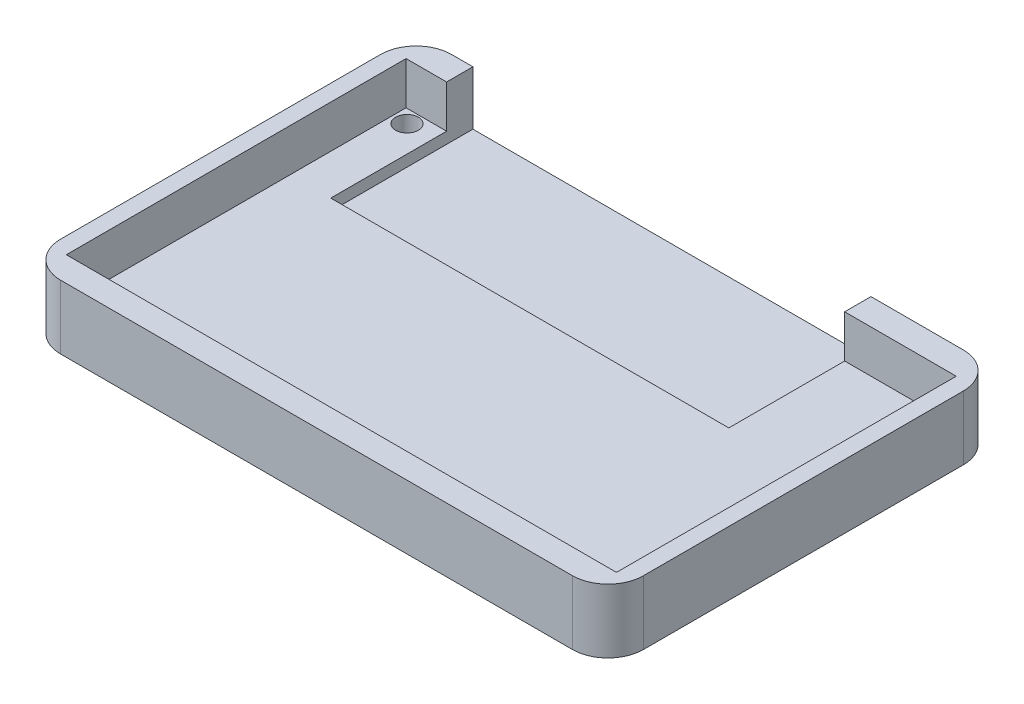
ISO-10303-21;
HEADER;
FILE_DESCRIPTION(('STEP AP214'),'2;1');
FILE_NAME('part.step','',(''),(''),'','','');
FILE_SCHEMA(('AUTOMOTIVE_DESIGN { 1 0 10303 214 1 1 1 1 }'));
ENDSEC;
DATA;
#1=APPLICATION_CONTEXT('core data for automotive mechanical design processes');
#2=APPLICATION_PROTOCOL_DEFINITION('international standard','automotive_design',2000,#1);
#3=PRODUCT_CONTEXT('',#1,'mechanical');
#4=PRODUCT('Part','Part','',(#3));
#5=PRODUCT_RELATED_PRODUCT_CATEGORY('part','',(#4));
#6=PRODUCT_DEFINITION_FORMATION('','',#4);
#7=PRODUCT_DEFINITION_CONTEXT('part definition',#1,'design');
#8=PRODUCT_DEFINITION('design','',#6,#7);
#9=PRODUCT_DEFINITION_SHAPE('','',#8);
#10=(LENGTH_UNIT() NAMED_UNIT(*) SI_UNIT(.MILLI.,.METRE.));
#11=(NAMED_UNIT(*) PLANE_ANGLE_UNIT() SI_UNIT($,.RADIAN.));
#12=(NAMED_UNIT(*) SI_UNIT($,.STERADIAN.) SOLID_ANGLE_UNIT());
#13=UNCERTAINTY_MEASURE_WITH_UNIT(LENGTH_MEASURE(1.E-05),#10,'distance_accuracy_value','');
#14=(GEOMETRIC_REPRESENTATION_CONTEXT(3) GLOBAL_UNCERTAINTY_ASSIGNED_CONTEXT((#13)) GLOBAL_UNIT_ASSIGNED_CONTEXT((#10,
#11,#12)) REPRESENTATION_CONTEXT('',''));
#15=CARTESIAN_POINT('',(0.,0.,0.));
#16=DIRECTION('',(0.,0.,1.));
#17=DIRECTION('',(1.,0.,0.));
#18=AXIS2_PLACEMENT_3D('',#15,#16,#17);
#19=CARTESIAN_POINT('',(0.,11.43,0.));
#20=DIRECTION('',(0.,1.,0.));
#21=DIRECTION('',(0.,0.,1.));
#22=AXIS2_PLACEMENT_3D('',#19,#20,#21);
#23=PLANE('',#22);
#24=DIRECTION('',(-1.,0.,0.));
#25=VECTOR('',#24,1.);
#26=CARTESIAN_POINT('',(-52.07,11.43,-34.925));
#27=LINE('',#26,#25);
#28=CARTESIAN_POINT('',(-41.91,11.43,-34.925));
#29=VERTEX_POINT('',#28);
#30=CARTESIAN_POINT('',(-45.72,11.43,-34.925));
#31=VERTEX_POINT('',#30);
#32=EDGE_CURVE('E254',#29,#31,#27,.T.);
#33=ORIENTED_EDGE('',*,*,#32,.T.);
#34=CARTESIAN_POINT('',(-45.72,11.43,-28.575));
#35=DIRECTION('',(0.,1.,0.));
#36=DIRECTION('',(0.,0.,1.));
#37=AXIS2_PLACEMENT_3D('',#34,#35,#36);
#38=CIRCLE('',#37,6.35);
#39=CARTESIAN_POINT('',(-52.07,11.43,-28.575));
#40=VERTEX_POINT('',#39);
#41=EDGE_CURVE('E310',#31,#40,#38,.T.);
#42=ORIENTED_EDGE('',*,*,#41,.T.);
#43=DIRECTION('',(0.,0.,1.));
#44=VECTOR('',#43,1.);
#45=CARTESIAN_POINT('',(-52.07,11.43,-34.925));
#46=LINE('',#45,#44);
#47=CARTESIAN_POINT('',(-52.07,11.43,28.575));
#48=VERTEX_POINT('',#47);
#49=EDGE_CURVE('E246',#40,#48,#46,.T.);
#50=ORIENTED_EDGE('',*,*,#49,.T.);
#51=CARTESIAN_POINT('',(-45.72,11.43,28.575));
#52=DIRECTION('',(0.,1.,0.));
#53=DIRECTION('',(0.,0.,1.));
#54=AXIS2_PLACEMENT_3D('',#51,#52,#53);
#55=CIRCLE('',#54,6.35);
#56=CARTESIAN_POINT('',(-45.72,11.43,34.925));
#57=VERTEX_POINT('',#56);
#58=EDGE_CURVE('E308',#48,#57,#55,.T.);
#59=ORIENTED_EDGE('',*,*,#58,.T.);
#60=DIRECTION('',(1.,0.,0.));
#61=VECTOR('',#60,1.);
#62=CARTESIAN_POINT('',(-52.07,11.43,34.925));
#63=LINE('',#62,#61);
#64=CARTESIAN_POINT('',(45.72,11.43,34.925));
#65=VERTEX_POINT('',#64);
#66=EDGE_CURVE('E249',#57,#65,#63,.T.);
#67=ORIENTED_EDGE('',*,*,#66,.T.);
#68=CARTESIAN_POINT('',(45.72,11.43,28.575));
#69=DIRECTION('',(0.,1.,0.));
#70=DIRECTION('',(0.,0.,1.));
#71=AXIS2_PLACEMENT_3D('',#68,#69,#70);
#72=CIRCLE('',#71,6.35);
#73=CARTESIAN_POINT('',(52.07,11.43,28.575));
#74=VERTEX_POINT('',#73);
#75=EDGE_CURVE('E59',#65,#74,#72,.T.);
#76=ORIENTED_EDGE('',*,*,#75,.T.);
#77=DIRECTION('',(0.,0.,-1.));
#78=VECTOR('',#77,1.);
#79=CARTESIAN_POINT('',(52.07,11.43,-34.925));
#80=LINE('',#79,#78);
#81=CARTESIAN_POINT('',(52.07,11.43,-28.575));
#82=VERTEX_POINT('',#81);
#83=EDGE_CURVE('E252',#74,#82,#80,.T.);
#84=ORIENTED_EDGE('',*,*,#83,.T.);
#85=CARTESIAN_POINT('',(45.72,11.43,-28.575));
#86=DIRECTION('',(0.,1.,0.));
#87=DIRECTION('',(0.,0.,1.));
#88=AXIS2_PLACEMENT_3D('',#85,#86,#87);
#89=CIRCLE('',#88,6.35);
#90=CARTESIAN_POINT('',(45.72,11.43,-34.925));
#91=VERTEX_POINT('',#90);
#92=EDGE_CURVE('E306',#82,#91,#89,.T.);
#93=ORIENTED_EDGE('',*,*,#92,.T.);
#94=CARTESIAN_POINT('',(29.21,11.43,-34.925));
#95=VERTEX_POINT('',#94);
#96=EDGE_CURVE('E255',#91,#95,#27,.T.);
#97=ORIENTED_EDGE('',*,*,#96,.T.);
#98=DIRECTION('',(0.,0.,-1.));
#99=VECTOR('',#98,1.);
#100=CARTESIAN_POINT('',(29.21,11.43,-9.525));
#101=LINE('',#100,#99);
#102=CARTESIAN_POINT('',(29.21,11.43,-30.226));
#103=VERTEX_POINT('',#102);
#104=EDGE_CURVE('E215',#103,#95,#101,.T.);
#105=ORIENTED_EDGE('',*,*,#104,.F.);
#106=DIRECTION('',(1.,0.,0.));
#107=VECTOR('',#106,1.);
#108=CARTESIAN_POINT('',(0.,11.43,-30.226));
#109=LINE('',#108,#107);
#110=CARTESIAN_POINT('',(49.149,11.43,-30.226));
#111=VERTEX_POINT('',#110);
#112=EDGE_CURVE('E208',#103,#111,#109,.T.);
#113=ORIENTED_EDGE('',*,*,#112,.T.);
#114=DIRECTION('',(0.,0.,1.));
#115=VECTOR('',#114,1.);
#116=CARTESIAN_POINT('',(49.149,11.43,0.));
#117=LINE('',#116,#115);
#118=CARTESIAN_POINT('',(49.149,11.43,30.48));
#119=VERTEX_POINT('',#118);
#120=EDGE_CURVE('E181',#111,#119,#117,.T.);
#121=ORIENTED_EDGE('',*,*,#120,.T.);
#122=DIRECTION('',(1.,0.,0.));
#123=VECTOR('',#122,1.);
#124=CARTESIAN_POINT('',(0.,11.43,30.48));
#125=LINE('',#124,#123);
#126=CARTESIAN_POINT('',(-49.149,11.43,30.48));
#127=VERTEX_POINT('',#126);
#128=EDGE_CURVE('E189',#127,#119,#125,.T.);
#129=ORIENTED_EDGE('',*,*,#128,.F.);
#130=DIRECTION('',(0.,0.,1.));
#131=VECTOR('',#130,1.);
#132=CARTESIAN_POINT('',(-49.149,11.43,0.));
#133=LINE('',#132,#131);
#134=CARTESIAN_POINT('',(-49.149,11.43,-30.226));
#135=VERTEX_POINT('',#134);
#136=EDGE_CURVE('E192',#135,#127,#133,.T.);
#137=ORIENTED_EDGE('',*,*,#136,.F.);
#138=CARTESIAN_POINT('',(-41.91,11.43,-30.226));
#139=VERTEX_POINT('',#138);
#140=EDGE_CURVE('E210',#135,#139,#109,.T.);
#141=ORIENTED_EDGE('',*,*,#140,.T.);
#142=DIRECTION('',(0.,0.,1.));
#143=VECTOR('',#142,1.);
#144=CARTESIAN_POINT('',(-41.91,11.43,0.));
#145=LINE('',#144,#143);
#146=EDGE_CURVE('E257',#29,#139,#145,.T.);
#147=ORIENTED_EDGE('',*,*,#146,.F.);
#148=EDGE_LOOP('',(#33,#42,#50,#59,#67,#76,#84,#93,#97,#105,#113,#121,#129,#137,#141,#147));
#149=FACE_BOUND('',#148,.T.);
#150=ADVANCED_FACE('F39',(#149),#23,.T.);
#151=CARTESIAN_POINT('',(-41.91,1.778,-9.525));
#152=DIRECTION('',(-1.,0.,0.));
#153=DIRECTION('',(0.,0.,1.));
#154=AXIS2_PLACEMENT_3D('',#151,#152,#153);
#155=PLANE('',#154);
#156=DIRECTION('',(0.,1.,0.));
#157=VECTOR('',#156,1.);
#158=CARTESIAN_POINT('',(-41.91,3.81,-30.226));
#159=LINE('',#158,#157);
#160=CARTESIAN_POINT('',(-41.91,3.81,-30.226));
#161=VERTEX_POINT('',#160);
#162=EDGE_CURVE('E220',#161,#139,#159,.T.);
#163=ORIENTED_EDGE('',*,*,#162,.F.);
#164=DIRECTION('',(0.,0.,-1.));
#165=VECTOR('',#164,1.);
#166=CARTESIAN_POINT('',(-41.91,3.81,0.));
#167=LINE('',#166,#165);
#168=CARTESIAN_POINT('',(-41.91,3.81,-9.525));
#169=VERTEX_POINT('',#168);
#170=EDGE_CURVE('E201',#169,#161,#167,.T.);
#171=ORIENTED_EDGE('',*,*,#170,.F.);
#172=DIRECTION('',(0.,1.,0.));
#173=VECTOR('',#172,1.);
#174=CARTESIAN_POINT('',(-41.91,1.778,-9.525));
#175=LINE('',#174,#173);
#176=CARTESIAN_POINT('',(-41.91,1.778,-9.525));
#177=VERTEX_POINT('',#176);
#178=EDGE_CURVE('E231',#177,#169,#175,.T.);
#179=ORIENTED_EDGE('',*,*,#178,.F.);
#180=DIRECTION('',(0.,0.,1.));
#181=VECTOR('',#180,1.);
#182=CARTESIAN_POINT('',(-41.91,1.778,-9.525));
#183=LINE('',#182,#181);
#184=CARTESIAN_POINT('',(-41.91,1.778,-34.925));
#185=VERTEX_POINT('',#184);
#186=EDGE_CURVE('E223',#185,#177,#183,.T.);
#187=ORIENTED_EDGE('',*,*,#186,.F.);
#188=DIRECTION('',(0.,-1.,0.));
#189=VECTOR('',#188,1.);
#190=CARTESIAN_POINT('',(-41.91,11.43,-34.925));
#191=LINE('',#190,#189);
#192=EDGE_CURVE('E242',#29,#185,#191,.T.);
#193=ORIENTED_EDGE('',*,*,#192,.F.);
#194=ORIENTED_EDGE('',*,*,#146,.T.);
#195=EDGE_LOOP('',(#163,#171,#179,#187,#193,#194));
#196=FACE_BOUND('',#195,.T.);
#197=ADVANCED_FACE('F348',(#196),#155,.F.);
#198=CARTESIAN_POINT('',(29.21,1.778,-9.525));
#199=DIRECTION('',(1.,0.,0.));
#200=DIRECTION('',(0.,0.,-1.));
#201=AXIS2_PLACEMENT_3D('',#198,#199,#200);
#202=PLANE('',#201);
#203=DIRECTION('',(0.,1.,0.));
#204=VECTOR('',#203,1.);
#205=CARTESIAN_POINT('',(29.21,3.81,-30.226));
#206=LINE('',#205,#204);
#207=CARTESIAN_POINT('',(29.21,3.81,-30.226));
#208=VERTEX_POINT('',#207);
#209=EDGE_CURVE('E169',#208,#103,#206,.T.);
#210=ORIENTED_EDGE('',*,*,#209,.T.);
#211=ORIENTED_EDGE('',*,*,#104,.T.);
#212=DIRECTION('',(0.,1.,0.));
#213=VECTOR('',#212,1.);
#214=CARTESIAN_POINT('',(29.21,11.43,-34.925));
#215=LINE('',#214,#213);
#216=CARTESIAN_POINT('',(29.21,1.778,-34.925));
#217=VERTEX_POINT('',#216);
#218=EDGE_CURVE('E237',#217,#95,#215,.T.);
#219=ORIENTED_EDGE('',*,*,#218,.F.);
#220=DIRECTION('',(0.,0.,-1.));
#221=VECTOR('',#220,1.);
#222=CARTESIAN_POINT('',(29.21,1.778,-9.525));
#223=LINE('',#222,#221);
#224=CARTESIAN_POINT('',(29.21,1.778,-9.525));
#225=VERTEX_POINT('',#224);
#226=EDGE_CURVE('E228',#225,#217,#223,.T.);
#227=ORIENTED_EDGE('',*,*,#226,.F.);
#228=DIRECTION('',(0.,1.,0.));
#229=VECTOR('',#228,1.);
#230=CARTESIAN_POINT('',(29.21,1.778,-9.525));
#231=LINE('',#230,#229);
#232=CARTESIAN_POINT('',(29.21,3.81,-9.525));
#233=VERTEX_POINT('',#232);
#234=EDGE_CURVE('E234',#225,#233,#231,.T.);
#235=ORIENTED_EDGE('',*,*,#234,.T.);
#236=DIRECTION('',(0.,0.,1.));
#237=VECTOR('',#236,1.);
#238=CARTESIAN_POINT('',(29.21,3.81,0.));
#239=LINE('',#238,#237);
#240=EDGE_CURVE('E173',#208,#233,#239,.T.);
#241=ORIENTED_EDGE('',*,*,#240,.F.);
#242=EDGE_LOOP('',(#210,#211,#219,#227,#235,#241));
#243=FACE_BOUND('',#242,.T.);
#244=ADVANCED_FACE('F337',(#243),#202,.F.);
#245=CARTESIAN_POINT('',(-41.91,1.778,-9.525));
#246=DIRECTION('',(0.,0.,1.));
#247=DIRECTION('',(1.,0.,0.));
#248=AXIS2_PLACEMENT_3D('',#245,#246,#247);
#249=PLANE('',#248);
#250=DIRECTION('',(-1.,0.,0.));
#251=VECTOR('',#250,1.);
#252=CARTESIAN_POINT('',(0.,3.81,-9.525));
#253=LINE('',#252,#251);
#254=EDGE_CURVE('E199',#233,#169,#253,.T.);
#255=ORIENTED_EDGE('',*,*,#254,.F.);
#256=ORIENTED_EDGE('',*,*,#234,.F.);
#257=DIRECTION('',(1.,0.,0.));
#258=VECTOR('',#257,1.);
#259=CARTESIAN_POINT('',(-41.91,1.778,-9.525));
#260=LINE('',#259,#258);
#261=EDGE_CURVE('E225',#177,#225,#260,.T.);
#262=ORIENTED_EDGE('',*,*,#261,.F.);
#263=ORIENTED_EDGE('',*,*,#178,.T.);
#264=EDGE_LOOP('',(#255,#256,#262,#263));
#265=FACE_BOUND('',#264,.T.);
#266=ADVANCED_FACE('F342',(#265),#249,.F.);
#267=CARTESIAN_POINT('',(-52.07,11.43,-34.925));
#268=DIRECTION('',(1.,0.,0.));
#269=DIRECTION('',(0.,0.,-1.));
#270=AXIS2_PLACEMENT_3D('',#267,#268,#269);
#271=PLANE('',#270);
#272=ORIENTED_EDGE('',*,*,#49,.F.);
#273=DIRECTION('',(0.,-1.,0.));
#274=VECTOR('',#273,1.);
#275=CARTESIAN_POINT('',(-52.07,11.43,-28.575));
#276=LINE('',#275,#274);
#277=CARTESIAN_POINT('',(-52.07,0.,-28.575));
#278=VERTEX_POINT('',#277);
#279=EDGE_CURVE('E289',#40,#278,#276,.T.);
#280=ORIENTED_EDGE('',*,*,#279,.T.);
#281=DIRECTION('',(0.,0.,1.));
#282=VECTOR('',#281,1.);
#283=CARTESIAN_POINT('',(-52.07,0.,-34.925));
#284=LINE('',#283,#282);
#285=CARTESIAN_POINT('',(-52.07,0.,28.575));
#286=VERTEX_POINT('',#285);
#287=EDGE_CURVE('E245',#278,#286,#284,.T.);
#288=ORIENTED_EDGE('',*,*,#287,.T.);
#289=DIRECTION('',(0.,-1.,0.));
#290=VECTOR('',#289,1.);
#291=CARTESIAN_POINT('',(-52.07,11.43,28.575));
#292=LINE('',#291,#290);
#293=EDGE_CURVE('E272',#286,#48,#292,.F.);
#294=ORIENTED_EDGE('',*,*,#293,.T.);
#295=EDGE_LOOP('',(#272,#280,#288,#294));
#296=FACE_BOUND('',#295,.T.);
#297=ADVANCED_FACE('F368',(#296),#271,.F.);
#298=CARTESIAN_POINT('',(-52.07,11.43,34.925));
#299=DIRECTION('',(0.,0.,-1.));
#300=DIRECTION('',(-1.,0.,0.));
#301=AXIS2_PLACEMENT_3D('',#298,#299,#300);
#302=PLANE('',#301);
#303=ORIENTED_EDGE('',*,*,#66,.F.);
#304=DIRECTION('',(0.,-1.,0.));
#305=VECTOR('',#304,1.);
#306=CARTESIAN_POINT('',(-45.72,11.43,34.925));
#307=LINE('',#306,#305);
#308=CARTESIAN_POINT('',(-45.72,0.,34.925));
#309=VERTEX_POINT('',#308);
#310=EDGE_CURVE('E314',#57,#309,#307,.T.);
#311=ORIENTED_EDGE('',*,*,#310,.T.);
#312=DIRECTION('',(1.,0.,0.));
#313=VECTOR('',#312,1.);
#314=CARTESIAN_POINT('',(-52.07,0.,34.925));
#315=LINE('',#314,#313);
#316=CARTESIAN_POINT('',(45.72,0.,34.925));
#317=VERTEX_POINT('',#316);
#318=EDGE_CURVE('E260',#309,#317,#315,.T.);
#319=ORIENTED_EDGE('',*,*,#318,.T.);
#320=DIRECTION('',(0.,-1.,0.));
#321=VECTOR('',#320,1.);
#322=CARTESIAN_POINT('',(45.72,11.43,34.925));
#323=LINE('',#322,#321);
#324=EDGE_CURVE('E312',#317,#65,#323,.F.);
#325=ORIENTED_EDGE('',*,*,#324,.T.);
#326=EDGE_LOOP('',(#303,#311,#319,#325));
#327=FACE_BOUND('',#326,.T.);
#328=ADVANCED_FACE('F376',(#327),#302,.F.);
#329=CARTESIAN_POINT('',(52.07,11.43,-34.925));
#330=DIRECTION('',(-1.,0.,0.));
#331=DIRECTION('',(0.,0.,1.));
#332=AXIS2_PLACEMENT_3D('',#329,#330,#331);
#333=PLANE('',#332);
#334=DIRECTION('',(0.,0.,-1.));
#335=VECTOR('',#334,1.);
#336=CARTESIAN_POINT('',(52.07,0.,-34.925));
#337=LINE('',#336,#335);
#338=CARTESIAN_POINT('',(52.07,0.,28.575));
#339=VERTEX_POINT('',#338);
#340=CARTESIAN_POINT('',(52.07,0.,-28.575));
#341=VERTEX_POINT('',#340);
#342=EDGE_CURVE('E263',#339,#341,#337,.T.);
#343=ORIENTED_EDGE('',*,*,#342,.T.);
#344=DIRECTION('',(0.,-1.,0.));
#345=VECTOR('',#344,1.);
#346=CARTESIAN_POINT('',(52.07,11.43,-28.575));
#347=LINE('',#346,#345);
#348=EDGE_CURVE('E11',#341,#82,#347,.F.);
#349=ORIENTED_EDGE('',*,*,#348,.T.);
#350=ORIENTED_EDGE('',*,*,#83,.F.);
#351=DIRECTION('',(0.,-1.,0.));
#352=VECTOR('',#351,1.);
#353=CARTESIAN_POINT('',(52.07,11.43,28.575));
#354=LINE('',#353,#352);
#355=EDGE_CURVE('E47',#74,#339,#354,.T.);
#356=ORIENTED_EDGE('',*,*,#355,.T.);
#357=EDGE_LOOP('',(#343,#349,#350,#356));
#358=FACE_BOUND('',#357,.T.);
#359=ADVANCED_FACE('F319',(#358),#333,.F.);
#360=CARTESIAN_POINT('',(-52.07,11.43,-34.925));
#361=DIRECTION('',(0.,0.,1.));
#362=DIRECTION('',(1.,0.,0.));
#363=AXIS2_PLACEMENT_3D('',#360,#361,#362);
#364=PLANE('',#363);
#365=DIRECTION('',(-1.,0.,0.));
#366=VECTOR('',#365,1.);
#367=CARTESIAN_POINT('',(-52.07,0.,-34.925));
#368=LINE('',#367,#366);
#369=CARTESIAN_POINT('',(45.72,0.,-34.925));
#370=VERTEX_POINT('',#369);
#371=CARTESIAN_POINT('',(-45.72,0.,-34.925));
#372=VERTEX_POINT('',#371);
#373=EDGE_CURVE('E250',#370,#372,#368,.T.);
#374=ORIENTED_EDGE('',*,*,#373,.T.);
#375=DIRECTION('',(0.,-1.,0.));
#376=VECTOR('',#375,1.);
#377=CARTESIAN_POINT('',(-45.72,11.43,-34.925));
#378=LINE('',#377,#376);
#379=EDGE_CURVE('E303',#372,#31,#378,.F.);
#380=ORIENTED_EDGE('',*,*,#379,.T.);
#381=ORIENTED_EDGE('',*,*,#32,.F.);
#382=ORIENTED_EDGE('',*,*,#192,.T.);
#383=DIRECTION('',(1.,0.,0.));
#384=VECTOR('',#383,1.);
#385=CARTESIAN_POINT('',(-52.07,1.778,-34.925));
#386=LINE('',#385,#384);
#387=EDGE_CURVE('E269',#185,#217,#386,.T.);
#388=ORIENTED_EDGE('',*,*,#387,.T.);
#389=ORIENTED_EDGE('',*,*,#218,.T.);
#390=ORIENTED_EDGE('',*,*,#96,.F.);
#391=DIRECTION('',(0.,-1.,0.));
#392=VECTOR('',#391,1.);
#393=CARTESIAN_POINT('',(45.72,11.43,-34.925));
#394=LINE('',#393,#392);
#395=EDGE_CURVE('E300',#91,#370,#394,.T.);
#396=ORIENTED_EDGE('',*,*,#395,.T.);
#397=EDGE_LOOP('',(#374,#380,#381,#382,#388,#389,#390,#396));
#398=FACE_BOUND('',#397,.T.);
#399=ADVANCED_FACE('F332',(#398),#364,.F.);
#400=CARTESIAN_POINT('',(0.,0.,0.));
#401=DIRECTION('',(0.,1.,0.));
#402=DIRECTION('',(0.,0.,1.));
#403=AXIS2_PLACEMENT_3D('',#400,#401,#402);
#404=PLANE('',#403);
#405=CARTESIAN_POINT('',(-46.609,0.,27.84475));
#406=DIRECTION('',(0.,1.,0.));
#407=DIRECTION('',(0.,0.,1.));
#408=AXIS2_PLACEMENT_3D('',#405,#406,#407);
#409=CIRCLE('',#408,2.032);
#410=CARTESIAN_POINT('',(-46.609,0.,29.87675));
#411=VERTEX_POINT('',#410);
#412=EDGE_CURVE('E195',#411,#411,#409,.T.);
#413=ORIENTED_EDGE('',*,*,#412,.T.);
#414=EDGE_LOOP('',(#413));
#415=FACE_BOUND('',#414,.T.);
#416=CARTESIAN_POINT('',(46.609,0.,27.84475));
#417=DIRECTION('',(0.,1.,0.));
#418=DIRECTION('',(0.,0.,1.));
#419=AXIS2_PLACEMENT_3D('',#416,#417,#418);
#420=CIRCLE('',#419,2.032);
#421=CARTESIAN_POINT('',(46.609,0.,29.87675));
#422=VERTEX_POINT('',#421);
#423=EDGE_CURVE('E284',#422,#422,#420,.T.);
#424=ORIENTED_EDGE('',*,*,#423,.T.);
#425=EDGE_LOOP('',(#424));
#426=FACE_BOUND('',#425,.T.);
#427=CARTESIAN_POINT('',(46.609,0.,-27.84475));
#428=DIRECTION('',(0.,1.,0.));
#429=DIRECTION('',(0.,0.,1.));
#430=AXIS2_PLACEMENT_3D('',#427,#428,#429);
#431=CIRCLE('',#430,2.032);
#432=CARTESIAN_POINT('',(46.609,0.,-25.81275));
#433=VERTEX_POINT('',#432);
#434=EDGE_CURVE('E280',#433,#433,#431,.T.);
#435=ORIENTED_EDGE('',*,*,#434,.T.);
#436=EDGE_LOOP('',(#435));
#437=FACE_BOUND('',#436,.T.);
#438=CARTESIAN_POINT('',(-46.609,0.,-27.84475));
#439=DIRECTION('',(0.,1.,0.));
#440=DIRECTION('',(0.,0.,1.));
#441=AXIS2_PLACEMENT_3D('',#438,#439,#440);
#442=CIRCLE('',#441,2.032);
#443=CARTESIAN_POINT('',(-46.609,0.,-25.81275));
#444=VERTEX_POINT('',#443);
#445=EDGE_CURVE('E276',#444,#444,#442,.T.);
#446=ORIENTED_EDGE('',*,*,#445,.T.);
#447=EDGE_LOOP('',(#446));
#448=FACE_BOUND('',#447,.T.);
#449=ORIENTED_EDGE('',*,*,#287,.F.);
#450=CARTESIAN_POINT('',(-45.72,0.,-28.575));
#451=DIRECTION('',(0.,1.,0.));
#452=DIRECTION('',(0.,0.,1.));
#453=AXIS2_PLACEMENT_3D('',#450,#451,#452);
#454=CIRCLE('',#453,6.35);
#455=EDGE_CURVE('E298',#278,#372,#454,.F.);
#456=ORIENTED_EDGE('',*,*,#455,.T.);
#457=ORIENTED_EDGE('',*,*,#373,.F.);
#458=CARTESIAN_POINT('',(45.72,0.,-28.575));
#459=DIRECTION('',(0.,1.,0.));
#460=DIRECTION('',(0.,0.,1.));
#461=AXIS2_PLACEMENT_3D('',#458,#459,#460);
#462=CIRCLE('',#461,6.35);
#463=EDGE_CURVE('E294',#370,#341,#462,.F.);
#464=ORIENTED_EDGE('',*,*,#463,.T.);
#465=ORIENTED_EDGE('',*,*,#342,.F.);
#466=CARTESIAN_POINT('',(45.72,0.,28.575));
#467=DIRECTION('',(0.,1.,0.));
#468=DIRECTION('',(0.,0.,1.));
#469=AXIS2_PLACEMENT_3D('',#466,#467,#468);
#470=CIRCLE('',#469,6.35);
#471=EDGE_CURVE('E292',#339,#317,#470,.F.);
#472=ORIENTED_EDGE('',*,*,#471,.T.);
#473=ORIENTED_EDGE('',*,*,#318,.F.);
#474=CARTESIAN_POINT('',(-45.72,0.,28.575));
#475=DIRECTION('',(0.,1.,0.));
#476=DIRECTION('',(0.,0.,1.));
#477=AXIS2_PLACEMENT_3D('',#474,#475,#476);
#478=CIRCLE('',#477,6.35);
#479=EDGE_CURVE('E296',#309,#286,#478,.F.);
#480=ORIENTED_EDGE('',*,*,#479,.T.);
#481=EDGE_LOOP('',(#449,#456,#457,#464,#465,#472,#473,#480));
#482=FACE_BOUND('',#481,.T.);
#483=ADVANCED_FACE('F323',(#415,#426,#437,#448,#482),#404,.F.);
#484=CARTESIAN_POINT('',(0.,1.778,0.));
#485=DIRECTION('',(0.,-1.,0.));
#486=DIRECTION('',(0.,0.,-1.));
#487=AXIS2_PLACEMENT_3D('',#484,#485,#486);
#488=PLANE('',#487);
#489=ORIENTED_EDGE('',*,*,#186,.T.);
#490=ORIENTED_EDGE('',*,*,#261,.T.);
#491=ORIENTED_EDGE('',*,*,#226,.T.);
#492=ORIENTED_EDGE('',*,*,#387,.F.);
#493=EDGE_LOOP('',(#489,#490,#491,#492));
#494=FACE_BOUND('',#493,.T.);
#495=ADVANCED_FACE('F394',(#494),#488,.F.);
#496=CARTESIAN_POINT('',(49.149,3.81,0.));
#497=DIRECTION('',(-1.,0.,0.));
#498=DIRECTION('',(0.,0.,1.));
#499=AXIS2_PLACEMENT_3D('',#496,#497,#498);
#500=PLANE('',#499);
#501=ORIENTED_EDGE('',*,*,#120,.F.);
#502=DIRECTION('',(0.,1.,0.));
#503=VECTOR('',#502,1.);
#504=CARTESIAN_POINT('',(49.149,3.81,-30.226));
#505=LINE('',#504,#503);
#506=CARTESIAN_POINT('',(49.149,3.81,-30.226));
#507=VERTEX_POINT('',#506);
#508=EDGE_CURVE('E166',#507,#111,#505,.T.);
#509=ORIENTED_EDGE('',*,*,#508,.F.);
#510=DIRECTION('',(0.,0.,1.));
#511=VECTOR('',#510,1.);
#512=CARTESIAN_POINT('',(49.149,3.81,0.));
#513=LINE('',#512,#511);
#514=CARTESIAN_POINT('',(49.149,3.81,30.48));
#515=VERTEX_POINT('',#514);
#516=EDGE_CURVE('E174',#507,#515,#513,.T.);
#517=ORIENTED_EDGE('',*,*,#516,.T.);
#518=DIRECTION('',(0.,1.,0.));
#519=VECTOR('',#518,1.);
#520=CARTESIAN_POINT('',(49.149,3.81,30.48));
#521=LINE('',#520,#519);
#522=EDGE_CURVE('E213',#515,#119,#521,.T.);
#523=ORIENTED_EDGE('',*,*,#522,.T.);
#524=EDGE_LOOP('',(#501,#509,#517,#523));
#525=FACE_BOUND('',#524,.T.);
#526=ADVANCED_FACE('F178',(#525),#500,.T.);
#527=CARTESIAN_POINT('',(0.,3.81,30.48));
#528=DIRECTION('',(0.,0.,1.));
#529=DIRECTION('',(1.,0.,0.));
#530=AXIS2_PLACEMENT_3D('',#527,#528,#529);
#531=PLANE('',#530);
#532=ORIENTED_EDGE('',*,*,#128,.T.);
#533=ORIENTED_EDGE('',*,*,#522,.F.);
#534=DIRECTION('',(1.,0.,0.));
#535=VECTOR('',#534,1.);
#536=CARTESIAN_POINT('',(0.,3.81,30.48));
#537=LINE('',#536,#535);
#538=CARTESIAN_POINT('',(-49.149,3.81,30.48));
#539=VERTEX_POINT('',#538);
#540=EDGE_CURVE('E183',#539,#515,#537,.T.);
#541=ORIENTED_EDGE('',*,*,#540,.F.);
#542=DIRECTION('',(0.,1.,0.));
#543=VECTOR('',#542,1.);
#544=CARTESIAN_POINT('',(-49.149,3.81,30.48));
#545=LINE('',#544,#543);
#546=EDGE_CURVE('E216',#539,#127,#545,.T.);
#547=ORIENTED_EDGE('',*,*,#546,.T.);
#548=EDGE_LOOP('',(#532,#533,#541,#547));
#549=FACE_BOUND('',#548,.T.);
#550=ADVANCED_FACE('F358',(#549),#531,.F.);
#551=CARTESIAN_POINT('',(-49.149,3.81,0.));
#552=DIRECTION('',(-1.,0.,0.));
#553=DIRECTION('',(0.,0.,1.));
#554=AXIS2_PLACEMENT_3D('',#551,#552,#553);
#555=PLANE('',#554);
#556=ORIENTED_EDGE('',*,*,#136,.T.);
#557=ORIENTED_EDGE('',*,*,#546,.F.);
#558=DIRECTION('',(0.,0.,1.));
#559=VECTOR('',#558,1.);
#560=CARTESIAN_POINT('',(-49.149,3.81,0.));
#561=LINE('',#560,#559);
#562=CARTESIAN_POINT('',(-49.149,3.81,-30.226));
#563=VERTEX_POINT('',#562);
#564=EDGE_CURVE('E204',#563,#539,#561,.T.);
#565=ORIENTED_EDGE('',*,*,#564,.F.);
#566=DIRECTION('',(0.,1.,0.));
#567=VECTOR('',#566,1.);
#568=CARTESIAN_POINT('',(-49.149,3.81,-30.226));
#569=LINE('',#568,#567);
#570=EDGE_CURVE('E218',#563,#135,#569,.T.);
#571=ORIENTED_EDGE('',*,*,#570,.T.);
#572=EDGE_LOOP('',(#556,#557,#565,#571));
#573=FACE_BOUND('',#572,.T.);
#574=ADVANCED_FACE('F353',(#573),#555,.F.);
#575=CARTESIAN_POINT('',(0.,3.81,-30.226));
#576=DIRECTION('',(0.,0.,1.));
#577=DIRECTION('',(1.,0.,0.));
#578=AXIS2_PLACEMENT_3D('',#575,#576,#577);
#579=PLANE('',#578);
#580=ORIENTED_EDGE('',*,*,#140,.F.);
#581=ORIENTED_EDGE('',*,*,#570,.F.);
#582=DIRECTION('',(1.,0.,0.));
#583=VECTOR('',#582,1.);
#584=CARTESIAN_POINT('',(0.,3.81,-30.226));
#585=LINE('',#584,#583);
#586=EDGE_CURVE('E176',#563,#161,#585,.T.);
#587=ORIENTED_EDGE('',*,*,#586,.T.);
#588=ORIENTED_EDGE('',*,*,#162,.T.);
#589=EDGE_LOOP('',(#580,#581,#587,#588));
#590=FACE_BOUND('',#589,.T.);
#591=ADVANCED_FACE('F476',(#590),#579,.T.);
#592=ORIENTED_EDGE('',*,*,#112,.F.);
#593=ORIENTED_EDGE('',*,*,#209,.F.);
#594=EDGE_CURVE('E163',#208,#507,#585,.T.);
#595=ORIENTED_EDGE('',*,*,#594,.T.);
#596=ORIENTED_EDGE('',*,*,#508,.T.);
#597=EDGE_LOOP('',(#592,#593,#595,#596));
#598=FACE_BOUND('',#597,.T.);
#599=ADVANCED_FACE('F165',(#598),#579,.T.);
#600=CARTESIAN_POINT('',(0.,3.81,0.));
#601=DIRECTION('',(0.,1.,0.));
#602=DIRECTION('',(0.,0.,1.));
#603=AXIS2_PLACEMENT_3D('',#600,#601,#602);
#604=PLANE('',#603);
#605=CARTESIAN_POINT('',(-46.609,3.81,27.84475));
#606=DIRECTION('',(0.,1.,0.));
#607=DIRECTION('',(0.,0.,1.));
#608=AXIS2_PLACEMENT_3D('',#605,#606,#607);
#609=CIRCLE('',#608,2.032);
#610=CARTESIAN_POINT('',(-46.609,3.81,29.87675));
#611=VERTEX_POINT('',#610);
#612=EDGE_CURVE('E285',#611,#611,#609,.T.);
#613=ORIENTED_EDGE('',*,*,#612,.F.);
#614=EDGE_LOOP('',(#613));
#615=FACE_BOUND('',#614,.T.);
#616=CARTESIAN_POINT('',(46.609,3.81,27.84475));
#617=DIRECTION('',(0.,1.,0.));
#618=DIRECTION('',(0.,0.,1.));
#619=AXIS2_PLACEMENT_3D('',#616,#617,#618);
#620=CIRCLE('',#619,2.032);
#621=CARTESIAN_POINT('',(46.609,3.81,29.87675));
#622=VERTEX_POINT('',#621);
#623=EDGE_CURVE('E281',#622,#622,#620,.T.);
#624=ORIENTED_EDGE('',*,*,#623,.F.);
#625=EDGE_LOOP('',(#624));
#626=FACE_BOUND('',#625,.T.);
#627=CARTESIAN_POINT('',(46.609,3.81,-27.84475));
#628=DIRECTION('',(0.,1.,0.));
#629=DIRECTION('',(0.,0.,1.));
#630=AXIS2_PLACEMENT_3D('',#627,#628,#629);
#631=CIRCLE('',#630,2.032);
#632=CARTESIAN_POINT('',(46.609,3.81,-25.81275));
#633=VERTEX_POINT('',#632);
#634=EDGE_CURVE('E277',#633,#633,#631,.T.);
#635=ORIENTED_EDGE('',*,*,#634,.F.);
#636=EDGE_LOOP('',(#635));
#637=FACE_BOUND('',#636,.T.);
#638=CARTESIAN_POINT('',(-46.609,3.81,-27.84475));
#639=DIRECTION('',(0.,1.,0.));
#640=DIRECTION('',(0.,0.,1.));
#641=AXIS2_PLACEMENT_3D('',#638,#639,#640);
#642=CIRCLE('',#641,2.032);
#643=CARTESIAN_POINT('',(-46.609,3.81,-25.81275));
#644=VERTEX_POINT('',#643);
#645=EDGE_CURVE('E273',#644,#644,#642,.T.);
#646=ORIENTED_EDGE('',*,*,#645,.F.);
#647=EDGE_LOOP('',(#646));
#648=FACE_BOUND('',#647,.T.);
#649=ORIENTED_EDGE('',*,*,#516,.F.);
#650=ORIENTED_EDGE('',*,*,#594,.F.);
#651=ORIENTED_EDGE('',*,*,#240,.T.);
#652=ORIENTED_EDGE('',*,*,#254,.T.);
#653=ORIENTED_EDGE('',*,*,#170,.T.);
#654=ORIENTED_EDGE('',*,*,#586,.F.);
#655=ORIENTED_EDGE('',*,*,#564,.T.);
#656=ORIENTED_EDGE('',*,*,#540,.T.);
#657=EDGE_LOOP('',(#649,#650,#651,#652,#653,#654,#655,#656));
#658=FACE_BOUND('',#657,.T.);
#659=ADVANCED_FACE('F186',(#615,#626,#637,#648,#658),#604,.T.);
#660=CARTESIAN_POINT('',(-46.609,-1.27,-27.84475));
#661=DIRECTION('',(0.,1.,0.));
#662=DIRECTION('',(0.,0.,1.));
#663=AXIS2_PLACEMENT_3D('',#660,#661,#662);
#664=CYLINDRICAL_SURFACE('',#663,2.032);
#665=ORIENTED_EDGE('',*,*,#645,.T.);
#666=EDGE_LOOP('',(#665));
#667=FACE_BOUND('',#666,.T.);
#668=ORIENTED_EDGE('',*,*,#445,.F.);
#669=EDGE_LOOP('',(#668));
#670=FACE_BOUND('',#669,.T.);
#671=ADVANCED_FACE('F451',(#667,#670),#664,.F.);
#672=CARTESIAN_POINT('',(46.609,-1.27,-27.84475));
#673=DIRECTION('',(0.,1.,0.));
#674=DIRECTION('',(0.,0.,1.));
#675=AXIS2_PLACEMENT_3D('',#672,#673,#674);
#676=CYLINDRICAL_SURFACE('',#675,2.032);
#677=ORIENTED_EDGE('',*,*,#634,.T.);
#678=EDGE_LOOP('',(#677));
#679=FACE_BOUND('',#678,.T.);
#680=ORIENTED_EDGE('',*,*,#434,.F.);
#681=EDGE_LOOP('',(#680));
#682=FACE_BOUND('',#681,.T.);
#683=ADVANCED_FACE('F442',(#679,#682),#676,.F.);
#684=CARTESIAN_POINT('',(46.609,-1.27,27.84475));
#685=DIRECTION('',(0.,1.,0.));
#686=DIRECTION('',(0.,0.,1.));
#687=AXIS2_PLACEMENT_3D('',#684,#685,#686);
#688=CYLINDRICAL_SURFACE('',#687,2.032);
#689=ORIENTED_EDGE('',*,*,#623,.T.);
#690=EDGE_LOOP('',(#689));
#691=FACE_BOUND('',#690,.T.);
#692=ORIENTED_EDGE('',*,*,#423,.F.);
#693=EDGE_LOOP('',(#692));
#694=FACE_BOUND('',#693,.T.);
#695=ADVANCED_FACE('F433',(#691,#694),#688,.F.);
#696=CARTESIAN_POINT('',(-46.609,-1.27,27.84475));
#697=DIRECTION('',(0.,1.,0.));
#698=DIRECTION('',(0.,0.,1.));
#699=AXIS2_PLACEMENT_3D('',#696,#697,#698);
#700=CYLINDRICAL_SURFACE('',#699,2.032);
#701=ORIENTED_EDGE('',*,*,#612,.T.);
#702=EDGE_LOOP('',(#701));
#703=FACE_BOUND('',#702,.T.);
#704=ORIENTED_EDGE('',*,*,#412,.F.);
#705=EDGE_LOOP('',(#704));
#706=FACE_BOUND('',#705,.T.);
#707=ADVANCED_FACE('F405',(#703,#706),#700,.F.);
#708=CARTESIAN_POINT('',(-45.72,11.43,-28.575));
#709=DIRECTION('',(0.,-1.,0.));
#710=DIRECTION('',(0.,0.,-1.));
#711=AXIS2_PLACEMENT_3D('',#708,#709,#710);
#712=CYLINDRICAL_SURFACE('',#711,6.35);
#713=ORIENTED_EDGE('',*,*,#41,.F.);
#714=ORIENTED_EDGE('',*,*,#379,.F.);
#715=ORIENTED_EDGE('',*,*,#455,.F.);
#716=ORIENTED_EDGE('',*,*,#279,.F.);
#717=EDGE_LOOP('',(#713,#714,#715,#716));
#718=FACE_BOUND('',#717,.T.);
#719=ADVANCED_FACE('F366',(#718),#712,.T.);
#720=CARTESIAN_POINT('',(-45.72,11.43,28.575));
#721=DIRECTION('',(0.,-1.,0.));
#722=DIRECTION('',(0.,0.,-1.));
#723=AXIS2_PLACEMENT_3D('',#720,#721,#722);
#724=CYLINDRICAL_SURFACE('',#723,6.35);
#725=ORIENTED_EDGE('',*,*,#58,.F.);
#726=ORIENTED_EDGE('',*,*,#293,.F.);
#727=ORIENTED_EDGE('',*,*,#479,.F.);
#728=ORIENTED_EDGE('',*,*,#310,.F.);
#729=EDGE_LOOP('',(#725,#726,#727,#728));
#730=FACE_BOUND('',#729,.T.);
#731=ADVANCED_FACE('F373',(#730),#724,.T.);
#732=CARTESIAN_POINT('',(45.72,11.43,-28.575));
#733=DIRECTION('',(0.,-1.,0.));
#734=DIRECTION('',(0.,0.,-1.));
#735=AXIS2_PLACEMENT_3D('',#732,#733,#734);
#736=CYLINDRICAL_SURFACE('',#735,6.35);
#737=ORIENTED_EDGE('',*,*,#92,.F.);
#738=ORIENTED_EDGE('',*,*,#348,.F.);
#739=ORIENTED_EDGE('',*,*,#463,.F.);
#740=ORIENTED_EDGE('',*,*,#395,.F.);
#741=EDGE_LOOP('',(#737,#738,#739,#740));
#742=FACE_BOUND('',#741,.T.);
#743=ADVANCED_FACE('F329',(#742),#736,.T.);
#744=CARTESIAN_POINT('',(45.72,11.43,28.575));
#745=DIRECTION('',(0.,-1.,0.));
#746=DIRECTION('',(0.,0.,-1.));
#747=AXIS2_PLACEMENT_3D('',#744,#745,#746);
#748=CYLINDRICAL_SURFACE('',#747,6.35);
#749=ORIENTED_EDGE('',*,*,#75,.F.);
#750=ORIENTED_EDGE('',*,*,#324,.F.);
#751=ORIENTED_EDGE('',*,*,#471,.F.);
#752=ORIENTED_EDGE('',*,*,#355,.F.);
#753=EDGE_LOOP('',(#749,#750,#751,#752));
#754=FACE_BOUND('',#753,.T.);
#755=ADVANCED_FACE('F41',(#754),#748,.T.);
#756=CLOSED_SHELL('',(#150,#197,#244,#266,#297,#328,#359,#399,#483,#495,#526,#550,#574,#591,
#599,#659,#671,#683,#695,#707,#719,#731,#743,#755));
#757=MANIFOLD_SOLID_BREP('B2',#756);
#758=ADVANCED_BREP_SHAPE_REPRESENTATION('',(#18,#757),#14);
#759=SHAPE_DEFINITION_REPRESENTATION(#9,#758);
ENDSEC;
END-ISO-10303-21;
